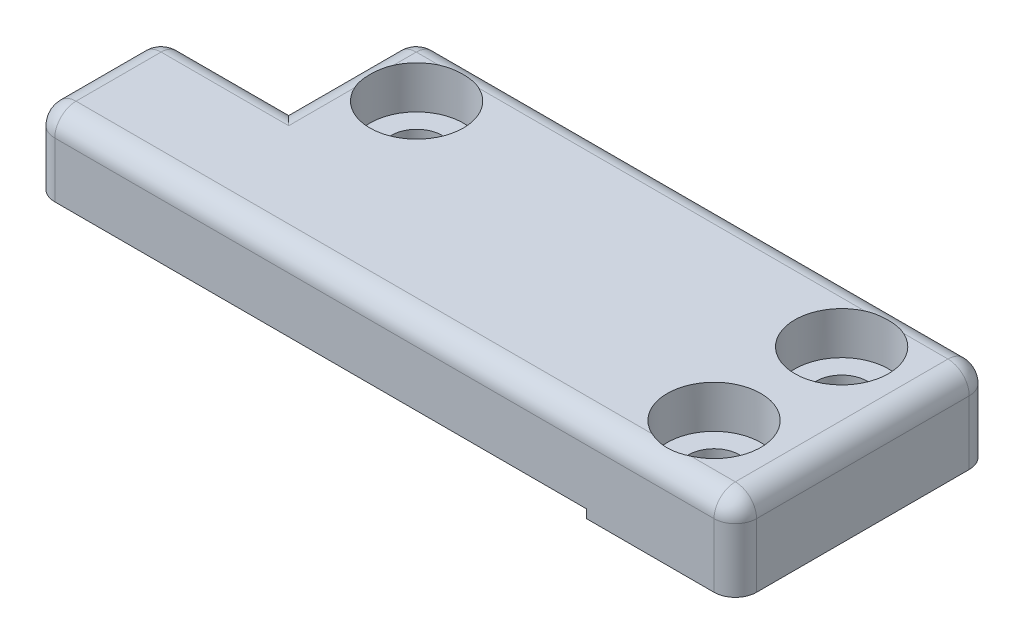
ISO-10303-21;
HEADER;
FILE_DESCRIPTION(('STEP AP214'),'2;1');
FILE_NAME('part.step','',(''),(''),'','','');
FILE_SCHEMA(('AUTOMOTIVE_DESIGN { 1 0 10303 214 1 1 1 1 }'));
ENDSEC;
DATA;
#1=APPLICATION_CONTEXT('core data for automotive mechanical design processes');
#2=APPLICATION_PROTOCOL_DEFINITION('international standard','automotive_design',2000,#1);
#3=PRODUCT_CONTEXT('',#1,'mechanical');
#4=PRODUCT('Part','Part','',(#3));
#5=PRODUCT_RELATED_PRODUCT_CATEGORY('part','',(#4));
#6=PRODUCT_DEFINITION_FORMATION('','',#4);
#7=PRODUCT_DEFINITION_CONTEXT('part definition',#1,'design');
#8=PRODUCT_DEFINITION('design','',#6,#7);
#9=PRODUCT_DEFINITION_SHAPE('','',#8);
#10=(LENGTH_UNIT() NAMED_UNIT(*) SI_UNIT(.MILLI.,.METRE.));
#11=(NAMED_UNIT(*) PLANE_ANGLE_UNIT() SI_UNIT($,.RADIAN.));
#12=(NAMED_UNIT(*) SI_UNIT($,.STERADIAN.) SOLID_ANGLE_UNIT());
#13=UNCERTAINTY_MEASURE_WITH_UNIT(LENGTH_MEASURE(1.E-05),#10,'distance_accuracy_value','');
#14=(GEOMETRIC_REPRESENTATION_CONTEXT(3) GLOBAL_UNCERTAINTY_ASSIGNED_CONTEXT((#13)) GLOBAL_UNIT_ASSIGNED_CONTEXT((#10,
#11,#12)) REPRESENTATION_CONTEXT('',''));
#15=CARTESIAN_POINT('',(0.,0.,0.));
#16=DIRECTION('',(0.,0.,1.));
#17=DIRECTION('',(1.,0.,0.));
#18=AXIS2_PLACEMENT_3D('',#15,#16,#17);
#19=CARTESIAN_POINT('',(0.,0.,0.));
#20=DIRECTION('',(0.,1.,0.));
#21=DIRECTION('',(0.,0.,1.));
#22=AXIS2_PLACEMENT_3D('',#19,#20,#21);
#23=PLANE('',#22);
#24=CARTESIAN_POINT('',(16.,0.,-3.00000000000022));
#25=DIRECTION('',(0.,1.,0.));
#26=DIRECTION('',(0.,0.,1.));
#27=AXIS2_PLACEMENT_3D('',#24,#25,#26);
#28=CIRCLE('',#27,1.2);
#29=CARTESIAN_POINT('',(16.,0.,-1.80000000000022));
#30=VERTEX_POINT('',#29);
#31=EDGE_CURVE('E209',#30,#30,#28,.T.);
#32=ORIENTED_EDGE('',*,*,#31,.T.);
#33=EDGE_LOOP('',(#32));
#34=FACE_BOUND('',#33,.T.);
#35=CARTESIAN_POINT('',(-4.,0.,-3.01501898938524));
#36=DIRECTION('',(0.,1.,0.));
#37=DIRECTION('',(0.,0.,1.));
#38=AXIS2_PLACEMENT_3D('',#35,#36,#37);
#39=CIRCLE('',#38,1.2);
#40=CARTESIAN_POINT('',(-4.,0.,-1.81501898938524));
#41=VERTEX_POINT('',#40);
#42=EDGE_CURVE('E218',#41,#41,#39,.T.);
#43=ORIENTED_EDGE('',*,*,#42,.T.);
#44=EDGE_LOOP('',(#43));
#45=FACE_BOUND('',#44,.T.);
#46=CARTESIAN_POINT('',(16.,0.,2.99999999999978));
#47=DIRECTION('',(0.,1.,0.));
#48=DIRECTION('',(0.,0.,1.));
#49=AXIS2_PLACEMENT_3D('',#46,#47,#48);
#50=CIRCLE('',#49,1.2);
#51=CARTESIAN_POINT('',(16.,0.,4.19999999999978));
#52=VERTEX_POINT('',#51);
#53=EDGE_CURVE('E214',#52,#52,#50,.T.);
#54=ORIENTED_EDGE('',*,*,#53,.T.);
#55=EDGE_LOOP('',(#54));
#56=FACE_BOUND('',#55,.T.);
#57=DIRECTION('',(0.,0.,-1.));
#58=VECTOR('',#57,1.);
#59=CARTESIAN_POINT('',(13.,0.,5.99999999999978));
#60=LINE('',#59,#58);
#61=CARTESIAN_POINT('',(13.,0.,5.99999999999978));
#62=VERTEX_POINT('',#61);
#63=CARTESIAN_POINT('',(13.,0.,-2.16840434497101E-13));
#64=VERTEX_POINT('',#63);
#65=EDGE_CURVE('E177',#62,#64,#60,.T.);
#66=ORIENTED_EDGE('',*,*,#65,.T.);
#67=DIRECTION('',(-1.,0.,0.));
#68=VECTOR('',#67,1.);
#69=CARTESIAN_POINT('',(-13.,0.,-2.16840434497101E-13));
#70=LINE('',#69,#68);
#71=CARTESIAN_POINT('',(-7.,0.,-2.16840434497101E-13));
#72=VERTEX_POINT('',#71);
#73=EDGE_CURVE('E197',#64,#72,#70,.T.);
#74=ORIENTED_EDGE('',*,*,#73,.T.);
#75=DIRECTION('',(0.,0.,1.));
#76=VECTOR('',#75,1.);
#77=CARTESIAN_POINT('',(-7.,0.,-6.00000000000022));
#78=LINE('',#77,#76);
#79=CARTESIAN_POINT('',(-7.,0.,-5.00000000000022));
#80=VERTEX_POINT('',#79);
#81=EDGE_CURVE('E249',#80,#72,#78,.T.);
#82=ORIENTED_EDGE('',*,*,#81,.F.);
#83=CARTESIAN_POINT('',(-6.,0.,-5.00000000000022));
#84=DIRECTION('',(0.,1.,0.));
#85=DIRECTION('',(0.,0.,1.));
#86=AXIS2_PLACEMENT_3D('',#83,#84,#85);
#87=CIRCLE('',#86,1.);
#88=CARTESIAN_POINT('',(-6.,0.,-6.00000000000022));
#89=VERTEX_POINT('',#88);
#90=EDGE_CURVE('E268',#80,#89,#87,.F.);
#91=ORIENTED_EDGE('',*,*,#90,.T.);
#92=DIRECTION('',(-1.,0.,0.));
#93=VECTOR('',#92,1.);
#94=CARTESIAN_POINT('',(-7.,0.,-6.00000000000022));
#95=LINE('',#94,#93);
#96=CARTESIAN_POINT('',(19.,0.,-6.00000000000022));
#97=VERTEX_POINT('',#96);
#98=EDGE_CURVE('E246',#97,#89,#95,.T.);
#99=ORIENTED_EDGE('',*,*,#98,.F.);
#100=CARTESIAN_POINT('',(19.,0.,-5.00000000000022));
#101=DIRECTION('',(0.,1.,0.));
#102=DIRECTION('',(0.,0.,1.));
#103=AXIS2_PLACEMENT_3D('',#100,#101,#102);
#104=CIRCLE('',#103,1.);
#105=CARTESIAN_POINT('',(20.,0.,-5.00000000000022));
#106=VERTEX_POINT('',#105);
#107=EDGE_CURVE('E270',#97,#106,#104,.F.);
#108=ORIENTED_EDGE('',*,*,#107,.T.);
#109=DIRECTION('',(0.,0.,-1.));
#110=VECTOR('',#109,1.);
#111=CARTESIAN_POINT('',(20.,0.,5.99999999999978));
#112=LINE('',#111,#110);
#113=CARTESIAN_POINT('',(20.,0.,4.99999999999978));
#114=VERTEX_POINT('',#113);
#115=EDGE_CURVE('E243',#114,#106,#112,.T.);
#116=ORIENTED_EDGE('',*,*,#115,.F.);
#117=CARTESIAN_POINT('',(19.,0.,4.99999999999978));
#118=DIRECTION('',(0.,1.,0.));
#119=DIRECTION('',(0.,0.,1.));
#120=AXIS2_PLACEMENT_3D('',#117,#118,#119);
#121=CIRCLE('',#120,1.);
#122=CARTESIAN_POINT('',(19.,0.,5.99999999999978));
#123=VERTEX_POINT('',#122);
#124=EDGE_CURVE('E272',#114,#123,#121,.F.);
#125=ORIENTED_EDGE('',*,*,#124,.T.);
#126=DIRECTION('',(1.,0.,0.));
#127=VECTOR('',#126,1.);
#128=CARTESIAN_POINT('',(-13.,0.,5.99999999999978));
#129=LINE('',#128,#127);
#130=EDGE_CURVE('E238',#62,#123,#129,.T.);
#131=ORIENTED_EDGE('',*,*,#130,.F.);
#132=EDGE_LOOP('',(#66,#74,#82,#91,#99,#108,#116,#125,#131));
#133=FACE_BOUND('',#132,.T.);
#134=ADVANCED_FACE('F32',(#34,#45,#56,#133),#23,.F.);
#135=CARTESIAN_POINT('',(-13.,4.,5.99999999999978));
#136=DIRECTION('',(1.,0.,0.));
#137=DIRECTION('',(0.,0.,-1.));
#138=AXIS2_PLACEMENT_3D('',#135,#136,#137);
#139=PLANE('',#138);
#140=DIRECTION('',(0.,0.,1.));
#141=VECTOR('',#140,1.);
#142=CARTESIAN_POINT('',(-13.,0.4,5.99999999999978));
#143=LINE('',#142,#141);
#144=CARTESIAN_POINT('',(-13.,0.4,0.999999999999784));
#145=VERTEX_POINT('',#144);
#146=CARTESIAN_POINT('',(-13.,0.4,4.99999999999978));
#147=VERTEX_POINT('',#146);
#148=EDGE_CURVE('E47',#145,#147,#143,.T.);
#149=ORIENTED_EDGE('',*,*,#148,.T.);
#150=DIRECTION('',(0.,-1.,0.));
#151=VECTOR('',#150,1.);
#152=CARTESIAN_POINT('',(-13.,4.,4.99999999999978));
#153=LINE('',#152,#151);
#154=CARTESIAN_POINT('',(-13.,3.,4.99999999999978));
#155=VERTEX_POINT('',#154);
#156=EDGE_CURVE('E263',#147,#155,#153,.F.);
#157=ORIENTED_EDGE('',*,*,#156,.T.);
#158=DIRECTION('',(0.,0.,1.));
#159=VECTOR('',#158,1.);
#160=CARTESIAN_POINT('',(-13.,3.,-2.16105646417613E-13));
#161=LINE('',#160,#159);
#162=CARTESIAN_POINT('',(-13.,3.,0.999999999999784));
#163=VERTEX_POINT('',#162);
#164=EDGE_CURVE('E255',#155,#163,#161,.F.);
#165=ORIENTED_EDGE('',*,*,#164,.T.);
#166=DIRECTION('',(0.,-1.,0.));
#167=VECTOR('',#166,1.);
#168=CARTESIAN_POINT('',(-13.,4.,0.999999999999784));
#169=LINE('',#168,#167);
#170=EDGE_CURVE('E265',#163,#145,#169,.T.);
#171=ORIENTED_EDGE('',*,*,#170,.T.);
#172=EDGE_LOOP('',(#149,#157,#165,#171));
#173=FACE_BOUND('',#172,.T.);
#174=ADVANCED_FACE('F355',(#173),#139,.F.);
#175=CARTESIAN_POINT('',(-13.,4.,5.99999999999978));
#176=DIRECTION('',(0.,0.,-1.));
#177=DIRECTION('',(-1.,0.,0.));
#178=AXIS2_PLACEMENT_3D('',#175,#176,#177);
#179=PLANE('',#178);
#180=DIRECTION('',(0.,-1.,0.));
#181=VECTOR('',#180,1.);
#182=CARTESIAN_POINT('',(13.,0.4,5.99999999999978));
#183=LINE('',#182,#181);
#184=CARTESIAN_POINT('',(13.,0.4,5.99999999999978));
#185=VERTEX_POINT('',#184);
#186=EDGE_CURVE('E171',#185,#62,#183,.T.);
#187=ORIENTED_EDGE('',*,*,#186,.T.);
#188=ORIENTED_EDGE('',*,*,#130,.T.);
#189=DIRECTION('',(0.,-1.,0.));
#190=VECTOR('',#189,1.);
#191=CARTESIAN_POINT('',(19.,4.,5.99999999999978));
#192=LINE('',#191,#190);
#193=CARTESIAN_POINT('',(19.,3.,5.99999999999978));
#194=VERTEX_POINT('',#193);
#195=EDGE_CURVE('E281',#123,#194,#192,.F.);
#196=ORIENTED_EDGE('',*,*,#195,.T.);
#197=DIRECTION('',(1.,0.,0.));
#198=VECTOR('',#197,1.);
#199=CARTESIAN_POINT('',(-13.,3.,5.99999999999978));
#200=LINE('',#199,#198);
#201=CARTESIAN_POINT('',(-12.,3.,5.99999999999978));
#202=VERTEX_POINT('',#201);
#203=EDGE_CURVE('E279',#194,#202,#200,.F.);
#204=ORIENTED_EDGE('',*,*,#203,.T.);
#205=DIRECTION('',(0.,-1.,0.));
#206=VECTOR('',#205,1.);
#207=CARTESIAN_POINT('',(-12.,4.,5.99999999999978));
#208=LINE('',#207,#206);
#209=CARTESIAN_POINT('',(-12.,0.4,5.99999999999978));
#210=VERTEX_POINT('',#209);
#211=EDGE_CURVE('E195',#202,#210,#208,.T.);
#212=ORIENTED_EDGE('',*,*,#211,.T.);
#213=DIRECTION('',(1.,0.,0.));
#214=VECTOR('',#213,1.);
#215=CARTESIAN_POINT('',(-13.,0.4,5.99999999999978));
#216=LINE('',#215,#214);
#217=EDGE_CURVE('E186',#210,#185,#216,.T.);
#218=ORIENTED_EDGE('',*,*,#217,.T.);
#219=EDGE_LOOP('',(#187,#188,#196,#204,#212,#218));
#220=FACE_BOUND('',#219,.T.);
#221=ADVANCED_FACE('F193',(#220),#179,.F.);
#222=CARTESIAN_POINT('',(-7.,4.,-2.16840434497101E-13));
#223=DIRECTION('',(0.,0.,1.));
#224=DIRECTION('',(1.,0.,0.));
#225=AXIS2_PLACEMENT_3D('',#222,#223,#224);
#226=PLANE('',#225);
#227=DIRECTION('',(-1.,0.,0.));
#228=VECTOR('',#227,1.);
#229=CARTESIAN_POINT('',(-13.,0.4,-2.16840434497101E-13));
#230=LINE('',#229,#228);
#231=CARTESIAN_POINT('',(-7.,0.4,-2.16840434497101E-13));
#232=VERTEX_POINT('',#231);
#233=CARTESIAN_POINT('',(-12.,0.4,-2.16406753628107E-13));
#234=VERTEX_POINT('',#233);
#235=EDGE_CURVE('E190',#232,#234,#230,.T.);
#236=ORIENTED_EDGE('',*,*,#235,.T.);
#237=DIRECTION('',(0.,-1.,0.));
#238=VECTOR('',#237,1.);
#239=CARTESIAN_POINT('',(-12.,4.,-2.16228111097527E-13));
#240=LINE('',#239,#238);
#241=CARTESIAN_POINT('',(-12.,3.,-2.16228111097527E-13));
#242=VERTEX_POINT('',#241);
#243=EDGE_CURVE('E277',#234,#242,#240,.F.);
#244=ORIENTED_EDGE('',*,*,#243,.T.);
#245=DIRECTION('',(-1.,0.,0.));
#246=VECTOR('',#245,1.);
#247=CARTESIAN_POINT('',(-7.,3.,-2.16840434497101E-13));
#248=LINE('',#247,#246);
#249=CARTESIAN_POINT('',(-7.,3.,-2.16840434497101E-13));
#250=VERTEX_POINT('',#249);
#251=EDGE_CURVE('E275',#242,#250,#248,.F.);
#252=ORIENTED_EDGE('',*,*,#251,.T.);
#253=DIRECTION('',(0.,-1.,0.));
#254=VECTOR('',#253,1.);
#255=CARTESIAN_POINT('',(-7.,4.,-2.16840434497101E-13));
#256=LINE('',#255,#254);
#257=EDGE_CURVE('E252',#250,#232,#256,.T.);
#258=ORIENTED_EDGE('',*,*,#257,.T.);
#259=EDGE_LOOP('',(#236,#244,#252,#258));
#260=FACE_BOUND('',#259,.T.);
#261=ADVANCED_FACE('F357',(#260),#226,.F.);
#262=CARTESIAN_POINT('',(-12.,4.,4.99999999999978));
#263=DIRECTION('',(0.,-1.,0.));
#264=DIRECTION('',(0.,0.,-1.));
#265=AXIS2_PLACEMENT_3D('',#262,#263,#264);
#266=CYLINDRICAL_SURFACE('',#265,1.);
#267=ORIENTED_EDGE('',*,*,#156,.F.);
#268=CARTESIAN_POINT('',(-12.,0.4,4.99999999999978));
#269=DIRECTION('',(0.,-1.,0.));
#270=DIRECTION('',(0.,0.,-1.));
#271=AXIS2_PLACEMENT_3D('',#268,#269,#270);
#272=CIRCLE('',#271,1.);
#273=EDGE_CURVE('E181',#147,#210,#272,.F.);
#274=ORIENTED_EDGE('',*,*,#273,.T.);
#275=ORIENTED_EDGE('',*,*,#211,.F.);
#276=CARTESIAN_POINT('',(-12.,3.,4.99999999999978));
#277=DIRECTION('',(0.,1.,0.));
#278=DIRECTION('',(0.,0.,1.));
#279=AXIS2_PLACEMENT_3D('',#276,#277,#278);
#280=CIRCLE('',#279,1.);
#281=EDGE_CURVE('E715',#155,#202,#280,.T.);
#282=ORIENTED_EDGE('',*,*,#281,.F.);
#283=EDGE_LOOP('',(#267,#274,#275,#282));
#284=FACE_BOUND('',#283,.T.);
#285=ADVANCED_FACE('F360',(#284),#266,.T.);
#286=CARTESIAN_POINT('',(-12.,4.,0.999999999999784));
#287=DIRECTION('',(0.,-1.,0.));
#288=DIRECTION('',(0.,0.,-1.));
#289=AXIS2_PLACEMENT_3D('',#286,#287,#288);
#290=CYLINDRICAL_SURFACE('',#289,1.);
#291=ORIENTED_EDGE('',*,*,#243,.F.);
#292=CARTESIAN_POINT('',(-12.,0.4,0.999999999999784));
#293=DIRECTION('',(0.,-1.,0.));
#294=DIRECTION('',(0.,0.,-1.));
#295=AXIS2_PLACEMENT_3D('',#292,#293,#294);
#296=CIRCLE('',#295,1.);
#297=EDGE_CURVE('E11',#234,#145,#296,.F.);
#298=ORIENTED_EDGE('',*,*,#297,.T.);
#299=ORIENTED_EDGE('',*,*,#170,.F.);
#300=CARTESIAN_POINT('',(-12.,3.,0.999999999999784));
#301=DIRECTION('',(0.,1.,0.));
#302=DIRECTION('',(0.,0.,1.));
#303=AXIS2_PLACEMENT_3D('',#300,#301,#302);
#304=CIRCLE('',#303,1.);
#305=EDGE_CURVE('E208',#163,#242,#304,.F.);
#306=ORIENTED_EDGE('',*,*,#305,.T.);
#307=EDGE_LOOP('',(#291,#298,#299,#306));
#308=FACE_BOUND('',#307,.T.);
#309=ADVANCED_FACE('F378',(#308),#290,.T.);
#310=CARTESIAN_POINT('',(0.,4.,0.));
#311=DIRECTION('',(0.,1.,0.));
#312=DIRECTION('',(0.,0.,1.));
#313=AXIS2_PLACEMENT_3D('',#310,#311,#312);
#314=PLANE('',#313);
#315=CARTESIAN_POINT('',(-4.,4.,-3.01501898938524));
#316=DIRECTION('',(0.,1.,0.));
#317=DIRECTION('',(0.,0.,1.));
#318=AXIS2_PLACEMENT_3D('',#315,#316,#317);
#319=CIRCLE('',#318,2.2);
#320=CARTESIAN_POINT('',(-6.,4.,-2.09850385039407));
#321=VERTEX_POINT('',#320);
#322=CARTESIAN_POINT('',(-3.05139555793895,4.,-5.00000000000022));
#323=VERTEX_POINT('',#322);
#324=EDGE_CURVE('E232',#321,#323,#319,.T.);
#325=ORIENTED_EDGE('',*,*,#324,.F.);
#326=DIRECTION('',(0.,0.,1.));
#327=VECTOR('',#326,1.);
#328=CARTESIAN_POINT('',(-6.,4.,-2.16551313917771E-13));
#329=LINE('',#328,#327);
#330=CARTESIAN_POINT('',(-6.,4.,0.999999999999783));
#331=VERTEX_POINT('',#330);
#332=EDGE_CURVE('E54',#321,#331,#329,.T.);
#333=ORIENTED_EDGE('',*,*,#332,.T.);
#334=DIRECTION('',(-1.,0.,0.));
#335=VECTOR('',#334,1.);
#336=CARTESIAN_POINT('',(-13.,4.,0.999999999999784));
#337=LINE('',#336,#335);
#338=CARTESIAN_POINT('',(-12.,4.,0.999999999999784));
#339=VERTEX_POINT('',#338);
#340=EDGE_CURVE('E317',#331,#339,#337,.T.);
#341=ORIENTED_EDGE('',*,*,#340,.T.);
#342=DIRECTION('',(0.,0.,1.));
#343=VECTOR('',#342,1.);
#344=CARTESIAN_POINT('',(-12.,4.,5.99999999999978));
#345=LINE('',#344,#343);
#346=CARTESIAN_POINT('',(-12.,4.,4.99999999999978));
#347=VERTEX_POINT('',#346);
#348=EDGE_CURVE('E315',#339,#347,#345,.T.);
#349=ORIENTED_EDGE('',*,*,#348,.T.);
#350=DIRECTION('',(1.,0.,0.));
#351=VECTOR('',#350,1.);
#352=CARTESIAN_POINT('',(20.,4.,4.99999999999978));
#353=LINE('',#352,#351);
#354=CARTESIAN_POINT('',(15.0834848610088,4.,4.99999999999978));
#355=VERTEX_POINT('',#354);
#356=EDGE_CURVE('E313',#347,#355,#353,.T.);
#357=ORIENTED_EDGE('',*,*,#356,.T.);
#358=CARTESIAN_POINT('',(16.,4.,2.99999999999978));
#359=DIRECTION('',(0.,1.,0.));
#360=DIRECTION('',(0.,0.,1.));
#361=AXIS2_PLACEMENT_3D('',#358,#359,#360);
#362=CIRCLE('',#361,2.2);
#363=CARTESIAN_POINT('',(16.9165151389912,4.,4.99999999999978));
#364=VERTEX_POINT('',#363);
#365=EDGE_CURVE('E225',#364,#355,#362,.T.);
#366=ORIENTED_EDGE('',*,*,#365,.F.);
#367=DIRECTION('',(1.,0.,0.));
#368=VECTOR('',#367,1.);
#369=CARTESIAN_POINT('',(20.,4.,4.99999999999978));
#370=LINE('',#369,#368);
#371=CARTESIAN_POINT('',(19.,4.,4.99999999999978));
#372=VERTEX_POINT('',#371);
#373=EDGE_CURVE('E311',#364,#372,#370,.T.);
#374=ORIENTED_EDGE('',*,*,#373,.T.);
#375=DIRECTION('',(0.,0.,-1.));
#376=VECTOR('',#375,1.);
#377=CARTESIAN_POINT('',(19.,4.,-6.00000000000022));
#378=LINE('',#377,#376);
#379=CARTESIAN_POINT('',(19.,4.,-5.00000000000022));
#380=VERTEX_POINT('',#379);
#381=EDGE_CURVE('E309',#372,#380,#378,.T.);
#382=ORIENTED_EDGE('',*,*,#381,.T.);
#383=DIRECTION('',(-1.,0.,0.));
#384=VECTOR('',#383,1.);
#385=CARTESIAN_POINT('',(-7.,4.,-5.00000000000022));
#386=LINE('',#385,#384);
#387=CARTESIAN_POINT('',(16.9165151389912,4.,-5.00000000000022));
#388=VERTEX_POINT('',#387);
#389=EDGE_CURVE('E307',#380,#388,#386,.T.);
#390=ORIENTED_EDGE('',*,*,#389,.T.);
#391=CARTESIAN_POINT('',(16.,4.,-3.00000000000022));
#392=DIRECTION('',(0.,1.,0.));
#393=DIRECTION('',(0.,0.,-1.));
#394=AXIS2_PLACEMENT_3D('',#391,#392,#393);
#395=CIRCLE('',#394,2.2);
#396=CARTESIAN_POINT('',(15.0834848610088,4.,-5.00000000000022));
#397=VERTEX_POINT('',#396);
#398=EDGE_CURVE('E226',#397,#388,#395,.T.);
#399=ORIENTED_EDGE('',*,*,#398,.F.);
#400=DIRECTION('',(-1.,0.,0.));
#401=VECTOR('',#400,1.);
#402=CARTESIAN_POINT('',(-7.,4.,-5.00000000000022));
#403=LINE('',#402,#401);
#404=EDGE_CURVE('E305',#397,#323,#403,.T.);
#405=ORIENTED_EDGE('',*,*,#404,.T.);
#406=EDGE_LOOP('',(#325,#333,#341,#349,#357,#366,#374,#382,#390,#399,#405));
#407=FACE_BOUND('',#406,.T.);
#408=ADVANCED_FACE('F352',(#407),#314,.T.);
#409=CARTESIAN_POINT('',(16.,2.,-3.00000000000022));
#410=DIRECTION('',(0.,-1.,0.));
#411=DIRECTION('',(0.,0.,-1.));
#412=AXIS2_PLACEMENT_3D('',#409,#410,#411);
#413=PLANE('',#412);
#414=CARTESIAN_POINT('',(16.,2.,-3.00000000000022));
#415=DIRECTION('',(0.,1.,0.));
#416=DIRECTION('',(0.,0.,-1.));
#417=AXIS2_PLACEMENT_3D('',#414,#415,#416);
#418=CIRCLE('',#417,2.2);
#419=CARTESIAN_POINT('',(16.,2.,-5.20000000000022));
#420=VERTEX_POINT('',#419);
#421=EDGE_CURVE('E222',#420,#420,#418,.T.);
#422=ORIENTED_EDGE('',*,*,#421,.T.);
#423=EDGE_LOOP('',(#422));
#424=FACE_BOUND('',#423,.T.);
#425=CARTESIAN_POINT('',(16.,2.,-3.00000000000022));
#426=DIRECTION('',(0.,-1.,0.));
#427=DIRECTION('',(0.,0.,-1.));
#428=AXIS2_PLACEMENT_3D('',#425,#426,#427);
#429=CIRCLE('',#428,1.2);
#430=CARTESIAN_POINT('',(16.,2.,-4.20000000000022));
#431=VERTEX_POINT('',#430);
#432=EDGE_CURVE('E212',#431,#431,#429,.F.);
#433=ORIENTED_EDGE('',*,*,#432,.F.);
#434=EDGE_LOOP('',(#433));
#435=FACE_BOUND('',#434,.T.);
#436=ADVANCED_FACE('F429',(#424,#435),#413,.F.);
#437=CARTESIAN_POINT('',(16.,2.,2.99999999999978));
#438=DIRECTION('',(0.,1.,0.));
#439=DIRECTION('',(0.,0.,1.));
#440=AXIS2_PLACEMENT_3D('',#437,#438,#439);
#441=PLANE('',#440);
#442=CARTESIAN_POINT('',(16.,2.,2.99999999999978));
#443=DIRECTION('',(0.,1.,0.));
#444=DIRECTION('',(0.,0.,1.));
#445=AXIS2_PLACEMENT_3D('',#442,#443,#444);
#446=CIRCLE('',#445,2.2);
#447=CARTESIAN_POINT('',(16.,2.,5.19999999999979));
#448=VERTEX_POINT('',#447);
#449=EDGE_CURVE('E229',#448,#448,#446,.T.);
#450=ORIENTED_EDGE('',*,*,#449,.T.);
#451=EDGE_LOOP('',(#450));
#452=FACE_BOUND('',#451,.T.);
#453=CARTESIAN_POINT('',(16.,2.,2.99999999999978));
#454=DIRECTION('',(0.,1.,0.));
#455=DIRECTION('',(0.,0.,1.));
#456=AXIS2_PLACEMENT_3D('',#453,#454,#455);
#457=CIRCLE('',#456,1.2);
#458=CARTESIAN_POINT('',(16.,2.,4.19999999999978));
#459=VERTEX_POINT('',#458);
#460=EDGE_CURVE('E217',#459,#459,#457,.F.);
#461=ORIENTED_EDGE('',*,*,#460,.T.);
#462=EDGE_LOOP('',(#461));
#463=FACE_BOUND('',#462,.T.);
#464=ADVANCED_FACE('F427',(#452,#463),#441,.T.);
#465=CARTESIAN_POINT('',(-4.,2.,-3.01501898938524));
#466=DIRECTION('',(0.,1.,0.));
#467=DIRECTION('',(0.,0.,1.));
#468=AXIS2_PLACEMENT_3D('',#465,#466,#467);
#469=PLANE('',#468);
#470=CARTESIAN_POINT('',(-4.,2.,-3.01501898938524));
#471=DIRECTION('',(0.,1.,0.));
#472=DIRECTION('',(0.,0.,1.));
#473=AXIS2_PLACEMENT_3D('',#470,#471,#472);
#474=CIRCLE('',#473,2.2);
#475=CARTESIAN_POINT('',(-4.,2.,-0.815018989385244));
#476=VERTEX_POINT('',#475);
#477=EDGE_CURVE('E235',#476,#476,#474,.T.);
#478=ORIENTED_EDGE('',*,*,#477,.T.);
#479=EDGE_LOOP('',(#478));
#480=FACE_BOUND('',#479,.T.);
#481=CARTESIAN_POINT('',(-4.,2.,-3.01501898938524));
#482=DIRECTION('',(0.,1.,0.));
#483=DIRECTION('',(0.,0.,1.));
#484=AXIS2_PLACEMENT_3D('',#481,#482,#483);
#485=CIRCLE('',#484,1.2);
#486=CARTESIAN_POINT('',(-4.,2.,-1.81501898938524));
#487=VERTEX_POINT('',#486);
#488=EDGE_CURVE('E221',#487,#487,#485,.F.);
#489=ORIENTED_EDGE('',*,*,#488,.T.);
#490=EDGE_LOOP('',(#489));
#491=FACE_BOUND('',#490,.T.);
#492=ADVANCED_FACE('F345',(#480,#491),#469,.T.);
#493=CARTESIAN_POINT('',(20.,4.,5.99999999999978));
#494=DIRECTION('',(-1.,0.,0.));
#495=DIRECTION('',(0.,0.,1.));
#496=AXIS2_PLACEMENT_3D('',#493,#494,#495);
#497=PLANE('',#496);
#498=DIRECTION('',(0.,0.,-1.));
#499=VECTOR('',#498,1.);
#500=CARTESIAN_POINT('',(20.,3.,5.99999999999978));
#501=LINE('',#500,#499);
#502=CARTESIAN_POINT('',(20.,3.,-5.00000000000022));
#503=VERTEX_POINT('',#502);
#504=CARTESIAN_POINT('',(20.,3.,4.99999999999978));
#505=VERTEX_POINT('',#504);
#506=EDGE_CURVE('E284',#503,#505,#501,.F.);
#507=ORIENTED_EDGE('',*,*,#506,.T.);
#508=DIRECTION('',(0.,-1.,0.));
#509=VECTOR('',#508,1.);
#510=CARTESIAN_POINT('',(20.,4.,4.99999999999978));
#511=LINE('',#510,#509);
#512=EDGE_CURVE('E288',#505,#114,#511,.T.);
#513=ORIENTED_EDGE('',*,*,#512,.T.);
#514=ORIENTED_EDGE('',*,*,#115,.T.);
#515=DIRECTION('',(0.,-1.,0.));
#516=VECTOR('',#515,1.);
#517=CARTESIAN_POINT('',(20.,4.,-5.00000000000022));
#518=LINE('',#517,#516);
#519=EDGE_CURVE('E286',#106,#503,#518,.F.);
#520=ORIENTED_EDGE('',*,*,#519,.T.);
#521=EDGE_LOOP('',(#507,#513,#514,#520));
#522=FACE_BOUND('',#521,.T.);
#523=ADVANCED_FACE('F368',(#522),#497,.F.);
#524=CARTESIAN_POINT('',(-7.,4.,-6.00000000000022));
#525=DIRECTION('',(0.,0.,1.));
#526=DIRECTION('',(1.,0.,0.));
#527=AXIS2_PLACEMENT_3D('',#524,#525,#526);
#528=PLANE('',#527);
#529=DIRECTION('',(-1.,0.,0.));
#530=VECTOR('',#529,1.);
#531=CARTESIAN_POINT('',(20.,3.,-6.00000000000022));
#532=LINE('',#531,#530);
#533=CARTESIAN_POINT('',(-6.,3.,-6.00000000000022));
#534=VERTEX_POINT('',#533);
#535=CARTESIAN_POINT('',(19.,3.,-6.00000000000022));
#536=VERTEX_POINT('',#535);
#537=EDGE_CURVE('E290',#534,#536,#532,.F.);
#538=ORIENTED_EDGE('',*,*,#537,.T.);
#539=DIRECTION('',(0.,-1.,0.));
#540=VECTOR('',#539,1.);
#541=CARTESIAN_POINT('',(19.,4.,-6.00000000000022));
#542=LINE('',#541,#540);
#543=EDGE_CURVE('E294',#536,#97,#542,.T.);
#544=ORIENTED_EDGE('',*,*,#543,.T.);
#545=ORIENTED_EDGE('',*,*,#98,.T.);
#546=DIRECTION('',(0.,-1.,0.));
#547=VECTOR('',#546,1.);
#548=CARTESIAN_POINT('',(-6.,4.,-6.00000000000022));
#549=LINE('',#548,#547);
#550=EDGE_CURVE('E292',#89,#534,#549,.F.);
#551=ORIENTED_EDGE('',*,*,#550,.T.);
#552=EDGE_LOOP('',(#538,#544,#545,#551));
#553=FACE_BOUND('',#552,.T.);
#554=ADVANCED_FACE('F364',(#553),#528,.F.);
#555=CARTESIAN_POINT('',(-7.,4.,-6.00000000000022));
#556=DIRECTION('',(1.,0.,0.));
#557=DIRECTION('',(0.,0.,-1.));
#558=AXIS2_PLACEMENT_3D('',#555,#556,#557);
#559=PLANE('',#558);
#560=DIRECTION('',(0.,0.,1.));
#561=VECTOR('',#560,1.);
#562=CARTESIAN_POINT('',(-7.,3.,-6.00000000000022));
#563=LINE('',#562,#561);
#564=CARTESIAN_POINT('',(-7.,3.,-5.00000000000022));
#565=VERTEX_POINT('',#564);
#566=EDGE_CURVE('E296',#250,#565,#563,.F.);
#567=ORIENTED_EDGE('',*,*,#566,.T.);
#568=DIRECTION('',(0.,-1.,0.));
#569=VECTOR('',#568,1.);
#570=CARTESIAN_POINT('',(-7.,4.,-5.00000000000022));
#571=LINE('',#570,#569);
#572=EDGE_CURVE('E298',#565,#80,#571,.T.);
#573=ORIENTED_EDGE('',*,*,#572,.T.);
#574=ORIENTED_EDGE('',*,*,#81,.T.);
#575=DIRECTION('',(0.,-1.,0.));
#576=VECTOR('',#575,1.);
#577=CARTESIAN_POINT('',(-7.,4.,-2.16840434497101E-13));
#578=LINE('',#577,#576);
#579=EDGE_CURVE('E206',#232,#72,#578,.T.);
#580=ORIENTED_EDGE('',*,*,#579,.F.);
#581=ORIENTED_EDGE('',*,*,#257,.F.);
#582=EDGE_LOOP('',(#567,#573,#574,#580,#581));
#583=FACE_BOUND('',#582,.T.);
#584=ADVANCED_FACE('F350',(#583),#559,.F.);
#585=DIRECTION('',(-1.,0.,0.));
#586=VECTOR('',#585,1.);
#587=CARTESIAN_POINT('',(-7.,4.,-5.00000000000022));
#588=LINE('',#587,#586);
#589=CARTESIAN_POINT('',(-4.94860444206105,4.,-5.00000000000022));
#590=VERTEX_POINT('',#589);
#591=CARTESIAN_POINT('',(-6.,4.,-5.00000000000022));
#592=VERTEX_POINT('',#591);
#593=EDGE_CURVE('E300',#590,#592,#588,.T.);
#594=ORIENTED_EDGE('',*,*,#593,.T.);
#595=DIRECTION('',(0.,0.,1.));
#596=VECTOR('',#595,1.);
#597=CARTESIAN_POINT('',(-6.,4.,-2.16551313917771E-13));
#598=LINE('',#597,#596);
#599=CARTESIAN_POINT('',(-6.,4.,-3.93153412837641));
#600=VERTEX_POINT('',#599);
#601=EDGE_CURVE('E302',#592,#600,#598,.T.);
#602=ORIENTED_EDGE('',*,*,#601,.T.);
#603=EDGE_CURVE('E239',#590,#600,#319,.T.);
#604=ORIENTED_EDGE('',*,*,#603,.F.);
#605=EDGE_LOOP('',(#594,#602,#604));
#606=FACE_BOUND('',#605,.T.);
#607=ADVANCED_FACE('F343',(#606),#314,.T.);
#608=CARTESIAN_POINT('',(-4.,2.,-3.01501898938524));
#609=DIRECTION('',(0.,1.,0.));
#610=DIRECTION('',(0.,0.,1.));
#611=AXIS2_PLACEMENT_3D('',#608,#609,#610);
#612=CYLINDRICAL_SURFACE('',#611,2.2);
#613=ORIENTED_EDGE('',*,*,#477,.F.);
#614=EDGE_LOOP('',(#613));
#615=FACE_BOUND('',#614,.T.);
#616=ORIENTED_EDGE('',*,*,#603,.T.);
#617=CARTESIAN_POINT('',(-6.,4.,-3.93153412837641));
#618=CARTESIAN_POINT('',(-6.02548893981913,3.99996944360789,-3.87592602694088));
#619=CARTESIAN_POINT('',(-6.04864092514171,3.99902483412948,-3.81926737301833));
#620=CARTESIAN_POINT('',(-6.09014337245146,3.99615408421632,-3.7042445891412));
#621=CARTESIAN_POINT('',(-6.10849421082221,3.9942280207571,-3.64588059327507));
#622=CARTESIAN_POINT('',(-6.14025843227186,3.990242218081,-3.52787980678563));
#623=CARTESIAN_POINT('',(-6.15367564360524,3.98818258397459,-3.4682440411739));
#624=CARTESIAN_POINT('',(-6.17550455553188,3.98454152235001,-3.34805013217651));
#625=CARTESIAN_POINT('',(-6.18391650031236,3.982960071505,-3.28749203393568));
#626=CARTESIAN_POINT('',(-6.19571700811848,3.9806789997736,-3.16540590331962));
#627=CARTESIAN_POINT('',(-6.19906697023383,3.97998616111959,-3.10387399789127));
#628=CARTESIAN_POINT('',(-6.200594502635,3.97967470502873,-2.98074350225617));
#629=CARTESIAN_POINT('',(-6.1987720745327,3.98005608725711,-2.9191449120702));
#630=CARTESIAN_POINT('',(-6.18997360058365,3.98179936113067,-2.79639123307202));
#631=CARTESIAN_POINT('',(-6.18300258125457,3.98316029641511,-2.73523577040264));
#632=CARTESIAN_POINT('',(-6.1639717139014,3.98651197068867,-2.61376294613475));
#633=CARTESIAN_POINT('',(-6.15191322324257,3.98850254165211,-2.5534453654154));
#634=CARTESIAN_POINT('',(-6.12079308989272,3.99281915459105,-2.42585450077335));
#635=CARTESIAN_POINT('',(-6.10099957582458,3.99515386484398,-2.35875720178382));
#636=CARTESIAN_POINT('',(-6.06660470799979,3.99784492750163,-2.25979418876503));
#637=CARTESIAN_POINT('',(-6.05436255719801,3.9986066123441,-2.22710208079295));
#638=CARTESIAN_POINT('',(-6.02833348057739,3.99968299761477,-2.16232836932377));
#639=CARTESIAN_POINT('',(-6.01454642185836,3.99999765955608,-2.13024681862779));
#640=CARTESIAN_POINT('',(-6.,4.,-2.09850385039407));
#641=B_SPLINE_CURVE_WITH_KNOTS('',3,(#617,#618,#619,#620,#621,#622,#623,#624,#625,#626,#627,
#628,#629,#630,#631,#632,#633,#634,#635,#636,#637,#638,#639,#640),.UNSPECIFIED.,.F.,.F.,(4,2,2,
2,2,2,2,2,2,2,2,4),(0.,0.183430039088217,0.366845693956448,0.550118725361291,0.733382814865207,
0.918037481994575,1.10269209158006,1.28716666263755,1.47159204596155,1.68122221881608,
1.78593824014757,1.89066327656585),.UNSPECIFIED.);
#642=EDGE_CURVE('E327',#600,#321,#641,.T.);
#643=ORIENTED_EDGE('',*,*,#642,.T.);
#644=ORIENTED_EDGE('',*,*,#324,.T.);
#645=CARTESIAN_POINT('',(-3.05139555793895,4.,-5.00000000000022));
#646=CARTESIAN_POINT('',(-3.10644631587859,3.99997061987672,-5.0263143275807));
#647=CARTESIAN_POINT('',(-3.16257732126204,3.99896085572763,-5.0503196624164));
#648=CARTESIAN_POINT('',(-3.27660678323989,3.99585568483344,-5.09357948830569));
#649=CARTESIAN_POINT('',(-3.33450501415233,3.99376041617036,-5.11283458315563));
#650=CARTESIAN_POINT('',(-3.45162740174903,3.98936126346643,-5.14644984009615));
#651=CARTESIAN_POINT('',(-3.51085007374944,3.98705760499227,-5.16081521656657));
#652=CARTESIAN_POINT('',(-3.63029777016135,3.98289085980503,-5.18458751782595));
#653=CARTESIAN_POINT('',(-3.69052276641494,3.98102776073778,-5.19399458166514));
#654=CARTESIAN_POINT('',(-3.81212342319148,3.97818786155057,-5.20784388368833));
#655=CARTESIAN_POINT('',(-3.87350457072221,3.97721933893703,-5.21223983978609));
#656=CARTESIAN_POINT('',(-3.99642658871424,3.97642277019471,-5.21587522979516));
#657=CARTESIAN_POINT('',(-4.05796745896335,3.97659472255157,-5.21511467055354));
#658=CARTESIAN_POINT('',(-4.18071486614574,3.97804013039925,-5.20844476037271));
#659=CARTESIAN_POINT('',(-4.24192160583417,3.97931281973409,-5.20253899068028));
#660=CARTESIAN_POINT('',(-4.36358333212188,3.98265549888336,-5.18563663727596));
#661=CARTESIAN_POINT('',(-4.42403845522631,3.98472534167265,-5.17464099225339));
#662=CARTESIAN_POINT('',(-4.56407445124939,3.98988592957761,-5.14306064068782));
#663=CARTESIAN_POINT('',(-4.64321720380607,3.99308534232203,-5.12049141617308));
#664=CARTESIAN_POINT('',(-4.75961759201421,3.99687476099528,-5.0801265686458));
#665=CARTESIAN_POINT('',(-4.79802074468768,3.99796943717643,-5.06559187234961));
#666=CARTESIAN_POINT('',(-4.87397827418803,3.99953005325552,-5.03438704952179));
#667=CARTESIAN_POINT('',(-4.91153233244139,3.99999576089578,-5.01771613664127));
#668=CARTESIAN_POINT('',(-4.94860444206105,4.,-5.00000000000022));
#669=B_SPLINE_CURVE_WITH_KNOTS('',3,(#645,#646,#647,#648,#649,#650,#651,#652,#653,#654,#655,
#656,#657,#658,#659,#660,#661,#662,#663,#664,#665,#666,#667,#668),.UNSPECIFIED.,.F.,.F.,(4,2,2,
2,2,2,2,2,2,2,2,4),(0.,0.182961573148778,0.365899878312294,0.548642482947917,0.731379962502674,
0.915791850156198,1.10020349293867,1.2844868812099,1.46873629694485,1.71522800455711,
1.83839879500955,1.96161505601639),.UNSPECIFIED.);
#670=EDGE_CURVE('E320',#323,#590,#669,.T.);
#671=ORIENTED_EDGE('',*,*,#670,.T.);
#672=EDGE_LOOP('',(#616,#643,#644,#671));
#673=FACE_BOUND('',#672,.T.);
#674=ADVANCED_FACE('F337',(#615,#673),#612,.F.);
#675=CARTESIAN_POINT('',(16.,2.,2.99999999999978));
#676=DIRECTION('',(0.,1.,0.));
#677=DIRECTION('',(0.,0.,1.));
#678=AXIS2_PLACEMENT_3D('',#675,#676,#677);
#679=CYLINDRICAL_SURFACE('',#678,2.2);
#680=ORIENTED_EDGE('',*,*,#449,.F.);
#681=EDGE_LOOP('',(#680));
#682=FACE_BOUND('',#681,.T.);
#683=ORIENTED_EDGE('',*,*,#365,.T.);
#684=CARTESIAN_POINT('',(15.0834848610088,4.,4.99999999999978));
#685=CARTESIAN_POINT('',(15.1390929624444,3.99996944360789,5.02548893981892));
#686=CARTESIAN_POINT('',(15.1957516163669,3.99902483412948,5.04864092514149));
#687=CARTESIAN_POINT('',(15.310774400244,3.99615408421632,5.09014337245125));
#688=CARTESIAN_POINT('',(15.3691383961102,3.9942280207571,5.108494210822));
#689=CARTESIAN_POINT('',(15.4871391825996,3.990242218081,5.14025843227165));
#690=CARTESIAN_POINT('',(15.5467749482113,3.98818258397459,5.15367564360502));
#691=CARTESIAN_POINT('',(15.6669688572087,3.98454152235001,5.17550455553167));
#692=CARTESIAN_POINT('',(15.7275269554496,3.982960071505,5.18391650031214));
#693=CARTESIAN_POINT('',(15.8496130860656,3.9806789997736,5.19571700811827));
#694=CARTESIAN_POINT('',(15.911144991494,3.97998616111959,5.19906697023361));
#695=CARTESIAN_POINT('',(16.0342754871291,3.97967470502873,5.20059450263478));
#696=CARTESIAN_POINT('',(16.095874077315,3.98005608725711,5.19877207453248));
#697=CARTESIAN_POINT('',(16.2186277563132,3.98179936113067,5.18997360058343));
#698=CARTESIAN_POINT('',(16.2797832189826,3.98316029641511,5.18300258125436));
#699=CARTESIAN_POINT('',(16.4012560432505,3.98651197068867,5.16397171390118));
#700=CARTESIAN_POINT('',(16.4615736239698,3.98850254165211,5.15191322324236));
#701=CARTESIAN_POINT('',(16.5891644886119,3.99281915459105,5.1207930898925));
#702=CARTESIAN_POINT('',(16.6562617876014,3.99515386484398,5.10099957582437));
#703=CARTESIAN_POINT('',(16.7552248006202,3.99784492750163,5.06660470799958));
#704=CARTESIAN_POINT('',(16.7879169085923,3.9986066123441,5.0543625571978));
#705=CARTESIAN_POINT('',(16.8526906200615,3.99968299761477,5.02833348057718));
#706=CARTESIAN_POINT('',(16.8847721707575,3.99999765955608,5.01454642185815));
#707=CARTESIAN_POINT('',(16.9165151389912,4.,4.99999999999978));
#708=B_SPLINE_CURVE_WITH_KNOTS('',3,(#684,#685,#686,#687,#688,#689,#690,#691,#692,#693,#694,
#695,#696,#697,#698,#699,#700,#701,#702,#703,#704,#705,#706,#707),.UNSPECIFIED.,.F.,.F.,(4,2,2,
2,2,2,2,2,2,2,2,4),(0.,0.183430039088218,0.366845693956449,0.550118725361289,0.73338281486521,
0.918037481994577,1.10269209158006,1.28716666263755,1.47159204596155,1.68122221881608,
1.78593824014756,1.89066327656585),.UNSPECIFIED.);
#709=EDGE_CURVE('E412',#355,#364,#708,.T.);
#710=ORIENTED_EDGE('',*,*,#709,.T.);
#711=EDGE_LOOP('',(#683,#710));
#712=FACE_BOUND('',#711,.T.);
#713=ADVANCED_FACE('F342',(#682,#712),#679,.F.);
#714=CARTESIAN_POINT('',(16.,2.,-3.00000000000022));
#715=DIRECTION('',(0.,1.,0.));
#716=DIRECTION('',(0.,0.,1.));
#717=AXIS2_PLACEMENT_3D('',#714,#715,#716);
#718=CYLINDRICAL_SURFACE('',#717,2.2);
#719=ORIENTED_EDGE('',*,*,#421,.F.);
#720=EDGE_LOOP('',(#719));
#721=FACE_BOUND('',#720,.T.);
#722=ORIENTED_EDGE('',*,*,#398,.T.);
#723=CARTESIAN_POINT('',(16.9165151389912,4.,-5.00000000000022));
#724=CARTESIAN_POINT('',(16.8609070375556,3.99996944360789,-5.02548893981935));
#725=CARTESIAN_POINT('',(16.8042483836331,3.99902483412948,-5.04864092514193));
#726=CARTESIAN_POINT('',(16.689225599756,3.99615408421632,-5.09014337245168));
#727=CARTESIAN_POINT('',(16.6308616038898,3.9942280207571,-5.10849421082243));
#728=CARTESIAN_POINT('',(16.5128608174004,3.990242218081,-5.14025843227208));
#729=CARTESIAN_POINT('',(16.4532250517887,3.98818258397459,-5.15367564360545));
#730=CARTESIAN_POINT('',(16.3330311427913,3.98454152235001,-5.1755045555321));
#731=CARTESIAN_POINT('',(16.2724730445504,3.982960071505,-5.18391650031258));
#732=CARTESIAN_POINT('',(16.1503869139344,3.9806789997736,-5.1957170081187));
#733=CARTESIAN_POINT('',(16.088855008506,3.97998616111959,-5.19906697023405));
#734=CARTESIAN_POINT('',(15.9657245128709,3.97967470502873,-5.20059450263522));
#735=CARTESIAN_POINT('',(15.904125922685,3.98005608725711,-5.19877207453292));
#736=CARTESIAN_POINT('',(15.7813722436868,3.98179936113067,-5.18997360058387));
#737=CARTESIAN_POINT('',(15.7202167810174,3.98316029641511,-5.18300258125479));
#738=CARTESIAN_POINT('',(15.5987439567495,3.98651197068867,-5.16397171390162));
#739=CARTESIAN_POINT('',(15.5384263760302,3.98850254165211,-5.15191322324279));
#740=CARTESIAN_POINT('',(15.4108355113881,3.99281915459105,-5.12079308989294));
#741=CARTESIAN_POINT('',(15.3437382123986,3.99515386484398,-5.1009995758248));
#742=CARTESIAN_POINT('',(15.2447751993798,3.99784492750163,-5.06660470800001));
#743=CARTESIAN_POINT('',(15.2120830914077,3.9986066123441,-5.05436255719823));
#744=CARTESIAN_POINT('',(15.1473093799385,3.99968299761477,-5.02833348057761));
#745=CARTESIAN_POINT('',(15.1152278292425,3.99999765955608,-5.01454642185858));
#746=CARTESIAN_POINT('',(15.0834848610088,4.,-5.00000000000022));
#747=B_SPLINE_CURVE_WITH_KNOTS('',3,(#723,#724,#725,#726,#727,#728,#729,#730,#731,#732,#733,
#734,#735,#736,#737,#738,#739,#740,#741,#742,#743,#744,#745,#746),.UNSPECIFIED.,.F.,.F.,(4,2,2,
2,2,2,2,2,2,2,2,4),(0.,0.183430039088218,0.366845693956449,0.550118725361297,0.733382814865207,
0.918037481994577,1.10269209158006,1.28716666263755,1.47159204596154,1.68122221881608,
1.78593824014757,1.89066327656585),.UNSPECIFIED.);
#748=EDGE_CURVE('E40',#388,#397,#747,.T.);
#749=ORIENTED_EDGE('',*,*,#748,.T.);
#750=EDGE_LOOP('',(#722,#749));
#751=FACE_BOUND('',#750,.T.);
#752=ADVANCED_FACE('F425',(#721,#751),#718,.F.);
#753=CARTESIAN_POINT('',(-4.,4.,-3.01501898938524));
#754=DIRECTION('',(0.,-1.,0.));
#755=DIRECTION('',(0.,0.,-1.));
#756=AXIS2_PLACEMENT_3D('',#753,#754,#755);
#757=CYLINDRICAL_SURFACE('',#756,1.2);
#758=ORIENTED_EDGE('',*,*,#488,.F.);
#759=EDGE_LOOP('',(#758));
#760=FACE_BOUND('',#759,.T.);
#761=ORIENTED_EDGE('',*,*,#42,.F.);
#762=EDGE_LOOP('',(#761));
#763=FACE_BOUND('',#762,.T.);
#764=ADVANCED_FACE('F434',(#760,#763),#757,.F.);
#765=CARTESIAN_POINT('',(16.,4.,2.99999999999978));
#766=DIRECTION('',(0.,-1.,0.));
#767=DIRECTION('',(0.,0.,-1.));
#768=AXIS2_PLACEMENT_3D('',#765,#766,#767);
#769=CYLINDRICAL_SURFACE('',#768,1.2);
#770=ORIENTED_EDGE('',*,*,#460,.F.);
#771=EDGE_LOOP('',(#770));
#772=FACE_BOUND('',#771,.T.);
#773=ORIENTED_EDGE('',*,*,#53,.F.);
#774=EDGE_LOOP('',(#773));
#775=FACE_BOUND('',#774,.T.);
#776=ADVANCED_FACE('F441',(#772,#775),#769,.F.);
#777=CARTESIAN_POINT('',(16.,4.,-3.00000000000022));
#778=DIRECTION('',(0.,-1.,0.));
#779=DIRECTION('',(0.,0.,-1.));
#780=AXIS2_PLACEMENT_3D('',#777,#778,#779);
#781=CYLINDRICAL_SURFACE('',#780,1.2);
#782=ORIENTED_EDGE('',*,*,#31,.F.);
#783=EDGE_LOOP('',(#782));
#784=FACE_BOUND('',#783,.T.);
#785=ORIENTED_EDGE('',*,*,#432,.T.);
#786=EDGE_LOOP('',(#785));
#787=FACE_BOUND('',#786,.T.);
#788=ADVANCED_FACE('F445',(#784,#787),#781,.F.);
#789=CARTESIAN_POINT('',(19.,4.,-5.00000000000022));
#790=DIRECTION('',(0.,-1.,0.));
#791=DIRECTION('',(0.,0.,-1.));
#792=AXIS2_PLACEMENT_3D('',#789,#790,#791);
#793=CYLINDRICAL_SURFACE('',#792,1.);
#794=CARTESIAN_POINT('',(19.,3.,-5.00000000000022));
#795=DIRECTION('',(0.,1.,0.));
#796=DIRECTION('',(0.,0.,1.));
#797=AXIS2_PLACEMENT_3D('',#794,#795,#796);
#798=CIRCLE('',#797,1.);
#799=EDGE_CURVE('E213',#503,#536,#798,.T.);
#800=ORIENTED_EDGE('',*,*,#799,.F.);
#801=ORIENTED_EDGE('',*,*,#519,.F.);
#802=ORIENTED_EDGE('',*,*,#107,.F.);
#803=ORIENTED_EDGE('',*,*,#543,.F.);
#804=EDGE_LOOP('',(#800,#801,#802,#803));
#805=FACE_BOUND('',#804,.T.);
#806=ADVANCED_FACE('F34',(#805),#793,.T.);
#807=CARTESIAN_POINT('',(19.,3.,-5.00000000000022));
#808=DIRECTION('',(0.,0.,1.));
#809=DIRECTION('',(1.,0.,0.));
#810=AXIS2_PLACEMENT_3D('',#807,#808,#809);
#811=SPHERICAL_SURFACE('',#810,1.);
#812=CARTESIAN_POINT('',(19.,3.,-5.00000000000022));
#813=DIRECTION('',(1.,0.,0.));
#814=DIRECTION('',(0.,1.,0.));
#815=AXIS2_PLACEMENT_3D('',#812,#813,#814);
#816=CIRCLE('',#815,1.);
#817=EDGE_CURVE('E756',#380,#536,#816,.F.);
#818=ORIENTED_EDGE('',*,*,#817,.F.);
#819=CARTESIAN_POINT('',(19.,3.,-5.00000000000022));
#820=DIRECTION('',(0.,0.,-1.));
#821=DIRECTION('',(-1.,0.,0.));
#822=AXIS2_PLACEMENT_3D('',#819,#820,#821);
#823=CIRCLE('',#822,1.);
#824=EDGE_CURVE('E759',#503,#380,#823,.F.);
#825=ORIENTED_EDGE('',*,*,#824,.F.);
#826=ORIENTED_EDGE('',*,*,#799,.T.);
#827=EDGE_LOOP('',(#818,#825,#826));
#828=FACE_BOUND('',#827,.T.);
#829=ADVANCED_FACE('F533',(#828),#811,.T.);
#830=CARTESIAN_POINT('',(19.,3.,0.));
#831=DIRECTION('',(0.,0.,1.));
#832=DIRECTION('',(1.,0.,0.));
#833=AXIS2_PLACEMENT_3D('',#830,#831,#832);
#834=CYLINDRICAL_SURFACE('',#833,1.);
#835=ORIENTED_EDGE('',*,*,#824,.T.);
#836=ORIENTED_EDGE('',*,*,#381,.F.);
#837=CARTESIAN_POINT('',(19.,3.,4.99999999999978));
#838=DIRECTION('',(0.,0.,1.));
#839=DIRECTION('',(1.,0.,0.));
#840=AXIS2_PLACEMENT_3D('',#837,#838,#839);
#841=CIRCLE('',#840,1.);
#842=EDGE_CURVE('E753',#505,#372,#841,.T.);
#843=ORIENTED_EDGE('',*,*,#842,.F.);
#844=ORIENTED_EDGE('',*,*,#506,.F.);
#845=EDGE_LOOP('',(#835,#836,#843,#844));
#846=FACE_BOUND('',#845,.T.);
#847=ADVANCED_FACE('F525',(#846),#834,.T.);
#848=CARTESIAN_POINT('',(19.,4.,4.99999999999978));
#849=DIRECTION('',(0.,-1.,0.));
#850=DIRECTION('',(0.,0.,-1.));
#851=AXIS2_PLACEMENT_3D('',#848,#849,#850);
#852=CYLINDRICAL_SURFACE('',#851,1.);
#853=ORIENTED_EDGE('',*,*,#124,.F.);
#854=ORIENTED_EDGE('',*,*,#512,.F.);
#855=CARTESIAN_POINT('',(19.,3.,4.99999999999978));
#856=DIRECTION('',(0.,1.,0.));
#857=DIRECTION('',(0.,0.,1.));
#858=AXIS2_PLACEMENT_3D('',#855,#856,#857);
#859=CIRCLE('',#858,1.);
#860=EDGE_CURVE('E750',#194,#505,#859,.T.);
#861=ORIENTED_EDGE('',*,*,#860,.F.);
#862=ORIENTED_EDGE('',*,*,#195,.F.);
#863=EDGE_LOOP('',(#853,#854,#861,#862));
#864=FACE_BOUND('',#863,.T.);
#865=ADVANCED_FACE('F518',(#864),#852,.T.);
#866=CARTESIAN_POINT('',(-6.,4.,-5.00000000000022));
#867=DIRECTION('',(0.,-1.,0.));
#868=DIRECTION('',(0.,0.,-1.));
#869=AXIS2_PLACEMENT_3D('',#866,#867,#868);
#870=CYLINDRICAL_SURFACE('',#869,1.);
#871=ORIENTED_EDGE('',*,*,#90,.F.);
#872=ORIENTED_EDGE('',*,*,#572,.F.);
#873=CARTESIAN_POINT('',(-6.,3.,-5.00000000000022));
#874=DIRECTION('',(0.,1.,0.));
#875=DIRECTION('',(0.,0.,1.));
#876=AXIS2_PLACEMENT_3D('',#873,#874,#875);
#877=CIRCLE('',#876,1.);
#878=EDGE_CURVE('E747',#534,#565,#877,.T.);
#879=ORIENTED_EDGE('',*,*,#878,.F.);
#880=ORIENTED_EDGE('',*,*,#550,.F.);
#881=EDGE_LOOP('',(#871,#872,#879,#880));
#882=FACE_BOUND('',#881,.T.);
#883=ADVANCED_FACE('F511',(#882),#870,.T.);
#884=CARTESIAN_POINT('',(0.,3.,-5.00000000000022));
#885=DIRECTION('',(1.,0.,0.));
#886=DIRECTION('',(0.,0.,-1.));
#887=AXIS2_PLACEMENT_3D('',#884,#885,#886);
#888=CYLINDRICAL_SURFACE('',#887,1.);
#889=ORIENTED_EDGE('',*,*,#817,.T.);
#890=ORIENTED_EDGE('',*,*,#537,.F.);
#891=CARTESIAN_POINT('',(-6.,3.,-5.00000000000022));
#892=DIRECTION('',(-1.,0.,0.));
#893=DIRECTION('',(0.,0.,1.));
#894=AXIS2_PLACEMENT_3D('',#891,#892,#893);
#895=CIRCLE('',#894,1.);
#896=EDGE_CURVE('E744',#592,#534,#895,.T.);
#897=ORIENTED_EDGE('',*,*,#896,.F.);
#898=ORIENTED_EDGE('',*,*,#593,.F.);
#899=ORIENTED_EDGE('',*,*,#670,.F.);
#900=ORIENTED_EDGE('',*,*,#404,.F.);
#901=ORIENTED_EDGE('',*,*,#748,.F.);
#902=ORIENTED_EDGE('',*,*,#389,.F.);
#903=EDGE_LOOP('',(#889,#890,#897,#898,#899,#900,#901,#902));
#904=FACE_BOUND('',#903,.T.);
#905=ADVANCED_FACE('F333',(#904),#888,.T.);
#906=CARTESIAN_POINT('',(19.,3.,4.99999999999978));
#907=DIRECTION('',(0.,0.,1.));
#908=DIRECTION('',(1.,0.,0.));
#909=AXIS2_PLACEMENT_3D('',#906,#907,#908);
#910=SPHERICAL_SURFACE('',#909,1.);
#911=ORIENTED_EDGE('',*,*,#860,.T.);
#912=ORIENTED_EDGE('',*,*,#842,.T.);
#913=CARTESIAN_POINT('',(19.,3.,4.99999999999978));
#914=DIRECTION('',(1.,0.,0.));
#915=DIRECTION('',(0.,0.,-1.));
#916=AXIS2_PLACEMENT_3D('',#913,#914,#915);
#917=CIRCLE('',#916,1.);
#918=EDGE_CURVE('E741',#194,#372,#917,.F.);
#919=ORIENTED_EDGE('',*,*,#918,.F.);
#920=EDGE_LOOP('',(#911,#912,#919));
#921=FACE_BOUND('',#920,.T.);
#922=ADVANCED_FACE('F498',(#921),#910,.T.);
#923=CARTESIAN_POINT('',(-6.,3.,-5.00000000000022));
#924=DIRECTION('',(0.,0.,1.));
#925=DIRECTION('',(1.,0.,0.));
#926=AXIS2_PLACEMENT_3D('',#923,#924,#925);
#927=SPHERICAL_SURFACE('',#926,1.);
#928=ORIENTED_EDGE('',*,*,#896,.T.);
#929=ORIENTED_EDGE('',*,*,#878,.T.);
#930=CARTESIAN_POINT('',(-6.,3.,-5.00000000000022));
#931=DIRECTION('',(0.,0.,-1.));
#932=DIRECTION('',(-1.,0.,0.));
#933=AXIS2_PLACEMENT_3D('',#930,#931,#932);
#934=CIRCLE('',#933,1.);
#935=EDGE_CURVE('E739',#592,#565,#934,.F.);
#936=ORIENTED_EDGE('',*,*,#935,.F.);
#937=EDGE_LOOP('',(#928,#929,#936));
#938=FACE_BOUND('',#937,.T.);
#939=ADVANCED_FACE('F410',(#938),#927,.T.);
#940=CARTESIAN_POINT('',(0.,3.,4.99999999999978));
#941=DIRECTION('',(-1.,0.,0.));
#942=DIRECTION('',(0.,0.,1.));
#943=AXIS2_PLACEMENT_3D('',#940,#941,#942);
#944=CYLINDRICAL_SURFACE('',#943,1.);
#945=ORIENTED_EDGE('',*,*,#709,.F.);
#946=ORIENTED_EDGE('',*,*,#356,.F.);
#947=CARTESIAN_POINT('',(-12.,3.,4.99999999999978));
#948=DIRECTION('',(-1.,0.,0.));
#949=DIRECTION('',(0.,0.,1.));
#950=AXIS2_PLACEMENT_3D('',#947,#948,#949);
#951=CIRCLE('',#950,1.);
#952=EDGE_CURVE('E737',#202,#347,#951,.T.);
#953=ORIENTED_EDGE('',*,*,#952,.F.);
#954=ORIENTED_EDGE('',*,*,#203,.F.);
#955=ORIENTED_EDGE('',*,*,#918,.T.);
#956=ORIENTED_EDGE('',*,*,#373,.F.);
#957=EDGE_LOOP('',(#945,#946,#953,#954,#955,#956));
#958=FACE_BOUND('',#957,.T.);
#959=ADVANCED_FACE('F402',(#958),#944,.T.);
#960=CARTESIAN_POINT('',(-6.,3.,0.));
#961=DIRECTION('',(0.,0.,-1.));
#962=DIRECTION('',(-1.,0.,0.));
#963=AXIS2_PLACEMENT_3D('',#960,#961,#962);
#964=CYLINDRICAL_SURFACE('',#963,1.);
#965=ORIENTED_EDGE('',*,*,#935,.T.);
#966=ORIENTED_EDGE('',*,*,#566,.F.);
#967=CARTESIAN_POINT('',(-6.,3.,0.999999999999783));
#968=DIRECTION('',(0.707106781186547,0.,-0.707106781186547));
#969=DIRECTION('',(-0.707106781186547,0.,-0.707106781186548));
#970=AXIS2_PLACEMENT_3D('',#967,#968,#969);
#971=ELLIPSE('',#970,1.41421356237309,1.);
#972=EDGE_CURVE('E712',#331,#250,#971,.F.);
#973=ORIENTED_EDGE('',*,*,#972,.F.);
#974=ORIENTED_EDGE('',*,*,#332,.F.);
#975=ORIENTED_EDGE('',*,*,#642,.F.);
#976=ORIENTED_EDGE('',*,*,#601,.F.);
#977=EDGE_LOOP('',(#965,#966,#973,#974,#975,#976));
#978=FACE_BOUND('',#977,.T.);
#979=ADVANCED_FACE('F397',(#978),#964,.T.);
#980=CARTESIAN_POINT('',(-12.,3.,4.99999999999978));
#981=DIRECTION('',(0.,0.,1.));
#982=DIRECTION('',(1.,0.,0.));
#983=AXIS2_PLACEMENT_3D('',#980,#981,#982);
#984=SPHERICAL_SURFACE('',#983,1.);
#985=ORIENTED_EDGE('',*,*,#281,.T.);
#986=ORIENTED_EDGE('',*,*,#952,.T.);
#987=CARTESIAN_POINT('',(-12.,3.,4.99999999999978));
#988=DIRECTION('',(0.,0.,1.));
#989=DIRECTION('',(1.,0.,0.));
#990=AXIS2_PLACEMENT_3D('',#987,#988,#989);
#991=CIRCLE('',#990,1.);
#992=EDGE_CURVE('E716',#155,#347,#991,.F.);
#993=ORIENTED_EDGE('',*,*,#992,.F.);
#994=EDGE_LOOP('',(#985,#986,#993));
#995=FACE_BOUND('',#994,.T.);
#996=ADVANCED_FACE('F394',(#995),#984,.T.);
#997=CARTESIAN_POINT('',(0.,3.,0.999999999999782));
#998=DIRECTION('',(1.,0.,0.));
#999=DIRECTION('',(0.,0.,-1.));
#1000=AXIS2_PLACEMENT_3D('',#997,#998,#999);
#1001=CYLINDRICAL_SURFACE('',#1000,1.);
#1002=ORIENTED_EDGE('',*,*,#972,.T.);
#1003=ORIENTED_EDGE('',*,*,#251,.F.);
#1004=CARTESIAN_POINT('',(-12.,3.,0.999999999999784));
#1005=DIRECTION('',(-1.,0.,0.));
#1006=DIRECTION('',(0.,0.,1.));
#1007=AXIS2_PLACEMENT_3D('',#1004,#1005,#1006);
#1008=CIRCLE('',#1007,1.);
#1009=EDGE_CURVE('E720',#339,#242,#1008,.T.);
#1010=ORIENTED_EDGE('',*,*,#1009,.F.);
#1011=ORIENTED_EDGE('',*,*,#340,.F.);
#1012=EDGE_LOOP('',(#1002,#1003,#1010,#1011));
#1013=FACE_BOUND('',#1012,.T.);
#1014=ADVANCED_FACE('F390',(#1013),#1001,.T.);
#1015=CARTESIAN_POINT('',(-12.,3.,0.));
#1016=DIRECTION('',(0.,0.,-1.));
#1017=DIRECTION('',(-1.,0.,0.));
#1018=AXIS2_PLACEMENT_3D('',#1015,#1016,#1017);
#1019=CYLINDRICAL_SURFACE('',#1018,1.);
#1020=ORIENTED_EDGE('',*,*,#992,.T.);
#1021=ORIENTED_EDGE('',*,*,#348,.F.);
#1022=CARTESIAN_POINT('',(-12.,3.,0.999999999999784));
#1023=DIRECTION('',(0.,0.,-1.));
#1024=DIRECTION('',(0.,1.,0.));
#1025=AXIS2_PLACEMENT_3D('',#1022,#1023,#1024);
#1026=CIRCLE('',#1025,1.);
#1027=EDGE_CURVE('E727',#163,#339,#1026,.T.);
#1028=ORIENTED_EDGE('',*,*,#1027,.F.);
#1029=ORIENTED_EDGE('',*,*,#164,.F.);
#1030=EDGE_LOOP('',(#1020,#1021,#1028,#1029));
#1031=FACE_BOUND('',#1030,.T.);
#1032=ADVANCED_FACE('F386',(#1031),#1019,.T.);
#1033=CARTESIAN_POINT('',(-12.,3.,0.999999999999784));
#1034=DIRECTION('',(0.,0.,1.));
#1035=DIRECTION('',(1.,0.,0.));
#1036=AXIS2_PLACEMENT_3D('',#1033,#1034,#1035);
#1037=SPHERICAL_SURFACE('',#1036,1.);
#1038=ORIENTED_EDGE('',*,*,#1027,.T.);
#1039=ORIENTED_EDGE('',*,*,#1009,.T.);
#1040=ORIENTED_EDGE('',*,*,#305,.F.);
#1041=EDGE_LOOP('',(#1038,#1039,#1040));
#1042=FACE_BOUND('',#1041,.T.);
#1043=ADVANCED_FACE('F382',(#1042),#1037,.T.);
#1044=CARTESIAN_POINT('',(-13.,0.4,-2.16840434497101E-13));
#1045=DIRECTION('',(0.,0.,1.));
#1046=DIRECTION('',(1.,0.,0.));
#1047=AXIS2_PLACEMENT_3D('',#1044,#1045,#1046);
#1048=PLANE('',#1047);
#1049=ORIENTED_EDGE('',*,*,#579,.T.);
#1050=ORIENTED_EDGE('',*,*,#73,.F.);
#1051=DIRECTION('',(0.,-1.,0.));
#1052=VECTOR('',#1051,1.);
#1053=CARTESIAN_POINT('',(13.,0.4,-2.16840434497101E-13));
#1054=LINE('',#1053,#1052);
#1055=CARTESIAN_POINT('',(13.,0.4,-2.16840434497101E-13));
#1056=VERTEX_POINT('',#1055);
#1057=EDGE_CURVE('E182',#1056,#64,#1054,.T.);
#1058=ORIENTED_EDGE('',*,*,#1057,.F.);
#1059=EDGE_CURVE('E189',#1056,#232,#230,.T.);
#1060=ORIENTED_EDGE('',*,*,#1059,.T.);
#1061=EDGE_LOOP('',(#1049,#1050,#1058,#1060));
#1062=FACE_BOUND('',#1061,.T.);
#1063=ADVANCED_FACE('F385',(#1062),#1048,.T.);
#1064=CARTESIAN_POINT('',(13.,0.4,5.99999999999978));
#1065=DIRECTION('',(-1.,0.,0.));
#1066=DIRECTION('',(0.,0.,1.));
#1067=AXIS2_PLACEMENT_3D('',#1064,#1065,#1066);
#1068=PLANE('',#1067);
#1069=ORIENTED_EDGE('',*,*,#65,.F.);
#1070=ORIENTED_EDGE('',*,*,#186,.F.);
#1071=DIRECTION('',(0.,0.,-1.));
#1072=VECTOR('',#1071,1.);
#1073=CARTESIAN_POINT('',(13.,0.4,5.99999999999978));
#1074=LINE('',#1073,#1072);
#1075=EDGE_CURVE('E174',#185,#1056,#1074,.T.);
#1076=ORIENTED_EDGE('',*,*,#1075,.T.);
#1077=ORIENTED_EDGE('',*,*,#1057,.T.);
#1078=EDGE_LOOP('',(#1069,#1070,#1076,#1077));
#1079=FACE_BOUND('',#1078,.T.);
#1080=ADVANCED_FACE('F173',(#1079),#1068,.T.);
#1081=CARTESIAN_POINT('',(0.,0.4,0.));
#1082=DIRECTION('',(0.,-1.,0.));
#1083=DIRECTION('',(0.,0.,-1.));
#1084=AXIS2_PLACEMENT_3D('',#1081,#1082,#1083);
#1085=PLANE('',#1084);
#1086=ORIENTED_EDGE('',*,*,#148,.F.);
#1087=ORIENTED_EDGE('',*,*,#297,.F.);
#1088=ORIENTED_EDGE('',*,*,#235,.F.);
#1089=ORIENTED_EDGE('',*,*,#1059,.F.);
#1090=ORIENTED_EDGE('',*,*,#1075,.F.);
#1091=ORIENTED_EDGE('',*,*,#217,.F.);
#1092=ORIENTED_EDGE('',*,*,#273,.F.);
#1093=EDGE_LOOP('',(#1086,#1087,#1088,#1089,#1090,#1091,#1092));
#1094=FACE_BOUND('',#1093,.T.);
#1095=ADVANCED_FACE('F185',(#1094),#1085,.T.);
#1096=CLOSED_SHELL('',(#134,#174,#221,#261,#285,#309,#408,#436,#464,#492,#523,#554,#584,#607,
#674,#713,#752,#764,#776,#788,#806,#829,#847,#865,#883,#905,#922,#939,#959,#979,#996,#1014,
#1032,#1043,#1063,#1080,#1095));
#1097=MANIFOLD_SOLID_BREP('B2',#1096);
#1098=ADVANCED_BREP_SHAPE_REPRESENTATION('',(#18,#1097),#14);
#1099=SHAPE_DEFINITION_REPRESENTATION(#9,#1098);
ENDSEC;
END-ISO-10303-21;
